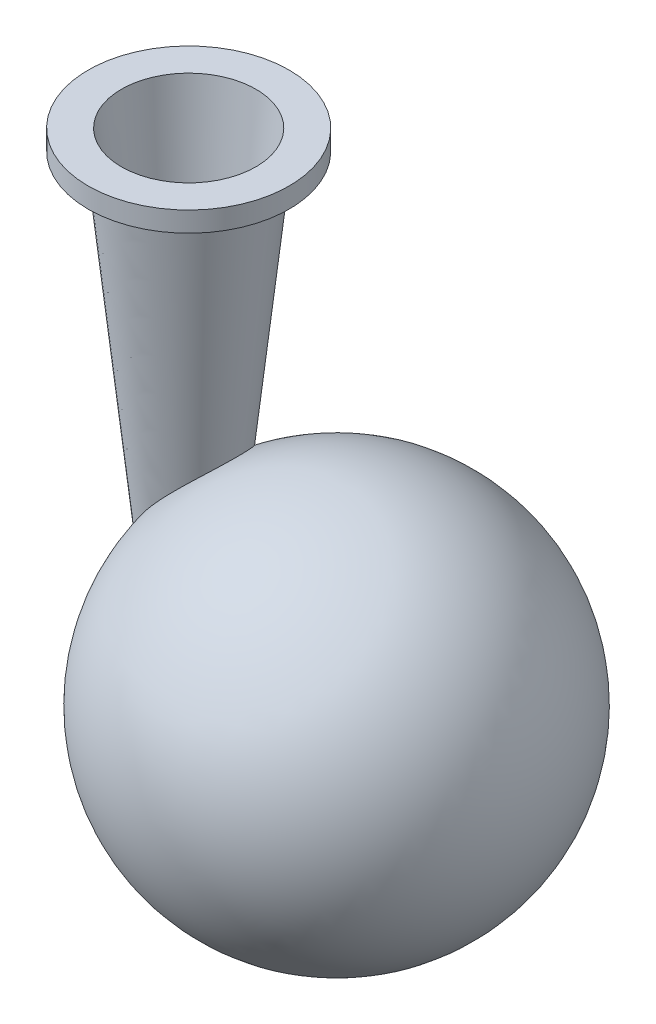
ISO-10303-21;
HEADER;
FILE_DESCRIPTION(('STEP AP214'),'2;1');
FILE_NAME('part.step','',(''),(''),'','','');
FILE_SCHEMA(('AUTOMOTIVE_DESIGN { 1 0 10303 214 1 1 1 1 }'));
ENDSEC;
DATA;
#1=APPLICATION_CONTEXT('core data for automotive mechanical design processes');
#2=APPLICATION_PROTOCOL_DEFINITION('international standard','automotive_design',2000,#1);
#3=PRODUCT_CONTEXT('',#1,'mechanical');
#4=PRODUCT('Part','Part','',(#3));
#5=PRODUCT_RELATED_PRODUCT_CATEGORY('part','',(#4));
#6=PRODUCT_DEFINITION_FORMATION('','',#4);
#7=PRODUCT_DEFINITION_CONTEXT('part definition',#1,'design');
#8=PRODUCT_DEFINITION('design','',#6,#7);
#9=PRODUCT_DEFINITION_SHAPE('','',#8);
#10=(LENGTH_UNIT() NAMED_UNIT(*) SI_UNIT(.MILLI.,.METRE.));
#11=(NAMED_UNIT(*) PLANE_ANGLE_UNIT() SI_UNIT($,.RADIAN.));
#12=(NAMED_UNIT(*) SI_UNIT($,.STERADIAN.) SOLID_ANGLE_UNIT());
#13=UNCERTAINTY_MEASURE_WITH_UNIT(LENGTH_MEASURE(1.E-05),#10,'distance_accuracy_value','');
#14=(GEOMETRIC_REPRESENTATION_CONTEXT(3) GLOBAL_UNCERTAINTY_ASSIGNED_CONTEXT((#13)) GLOBAL_UNIT_ASSIGNED_CONTEXT((#10,
#11,#12)) REPRESENTATION_CONTEXT('',''));
#15=CARTESIAN_POINT('',(0.,0.,0.));
#16=DIRECTION('',(0.,0.,1.));
#17=DIRECTION('',(1.,0.,0.));
#18=AXIS2_PLACEMENT_3D('',#15,#16,#17);
#19=CARTESIAN_POINT('',(-36.7934453221144,106.,0.));
#20=DIRECTION('',(0.,1.,0.));
#21=DIRECTION('',(0.,0.,1.));
#22=AXIS2_PLACEMENT_3D('',#19,#20,#21);
#23=PLANE('',#22);
#24=CARTESIAN_POINT('',(-36.7934453221144,106.,0.));
#25=DIRECTION('',(0.,1.,0.));
#26=DIRECTION('',(0.,0.,1.));
#27=AXIS2_PLACEMENT_3D('',#24,#25,#26);
#28=CIRCLE('',#27,16.7351960744522);
#29=CARTESIAN_POINT('',(-36.7934453221144,106.,16.7351960744522));
#30=VERTEX_POINT('',#29);
#31=EDGE_CURVE('E51',#30,#30,#28,.T.);
#32=ORIENTED_EDGE('',*,*,#31,.F.);
#33=EDGE_LOOP('',(#32));
#34=FACE_BOUND('',#33,.T.);
#35=CARTESIAN_POINT('',(-36.7934453221144,106.,0.));
#36=DIRECTION('',(0.,1.,0.));
#37=DIRECTION('',(0.,0.,1.));
#38=AXIS2_PLACEMENT_3D('',#35,#36,#37);
#39=CIRCLE('',#38,25.);
#40=CARTESIAN_POINT('',(-36.7934453221144,106.,25.));
#41=VERTEX_POINT('',#40);
#42=EDGE_CURVE('E78',#41,#41,#39,.T.);
#43=ORIENTED_EDGE('',*,*,#42,.T.);
#44=EDGE_LOOP('',(#43));
#45=FACE_BOUND('',#44,.T.);
#46=ADVANCED_FACE('F37',(#34,#45),#23,.T.);
#47=CARTESIAN_POINT('',(-36.7934453221144,106.209056926535,0.));
#48=DIRECTION('',(0.,1.,0.));
#49=DIRECTION('',(0.,0.,1.));
#50=AXIS2_PLACEMENT_3D('',#47,#48,#49);
#51=CONICAL_SURFACE('',#50,16.7571688428427,0.10471975511966);
#52=ORIENTED_EDGE('',*,*,#31,.T.);
#53=EDGE_LOOP('',(#52));
#54=FACE_BOUND('',#53,.T.);
#55=CARTESIAN_POINT('',(-27.4263025685843,36.9026804164011,1.41071099146784));
#56=CARTESIAN_POINT('',(-27.3970492944338,36.9310808457375,1.23651547855352));
#57=CARTESIAN_POINT('',(-27.373087259094,36.9543129977651,1.06059129479022));
#58=CARTESIAN_POINT('',(-27.3361602680941,36.9900971336509,0.706452942690002));
#59=CARTESIAN_POINT('',(-27.3231985256967,37.0026459968489,0.528238120663233));
#60=CARTESIAN_POINT('',(-27.3085183876449,37.0168575782865,0.170759458546034));
#61=CARTESIAN_POINT('',(-27.3068095690226,37.0185110237576,-0.00850514516609864));
#62=CARTESIAN_POINT('',(-27.314692056146,37.0108811310863,-0.366538051881213));
#63=CARTESIAN_POINT('',(-27.3242825316178,37.0015985965214,-0.545306390382389));
#64=CARTESIAN_POINT('',(-27.3545584177507,36.9722712288507,-0.900700380328845));
#65=CARTESIAN_POINT('',(-27.3752251542786,36.9522445099524,-1.07732912798217));
#66=CARTESIAN_POINT('',(-27.4272703357729,36.9017493298878,-1.4274826359512));
#67=CARTESIAN_POINT('',(-27.4586490039263,36.8712806511593,-1.60100733151356));
#68=CARTESIAN_POINT('',(-27.5315745729096,36.8003545177161,-1.94377510400843));
#69=CARTESIAN_POINT('',(-27.5731193472406,36.7598991519547,-2.11301906820616));
#70=CARTESIAN_POINT('',(-27.665736251553,36.6695291615726,-2.44635475959041));
#71=CARTESIAN_POINT('',(-27.7168122250198,36.6196107208085,-2.61044437697333));
#72=CARTESIAN_POINT('',(-27.8284627035048,36.5102305317104,-2.93471176187916));
#73=CARTESIAN_POINT('',(-27.8891521888707,36.4506530241141,-3.09481081275352));
#74=CARTESIAN_POINT('',(-28.0187158095815,36.3231118412911,-3.40822257298826));
#75=CARTESIAN_POINT('',(-28.0875925036742,36.2551455440607,-3.56153314008922));
#76=CARTESIAN_POINT('',(-28.3052819548724,36.0396658565888,-4.0105561964589));
#77=CARTESIAN_POINT('',(-28.4652006327547,35.880526272065,-4.29549229005575));
#78=CARTESIAN_POINT('',(-28.7647647630053,35.5801282677858,-4.76618991523883));
#79=CARTESIAN_POINT('',(-28.8993931746197,35.4444392306312,-4.95887060332119));
#80=CARTESIAN_POINT('',(-29.1791773853439,35.1606990861938,-5.326754558131));
#81=CARTESIAN_POINT('',(-29.324334538625,35.0126463883669,-5.5019555697731));
#82=CARTESIAN_POINT('',(-29.6233032441376,34.7056588272265,-5.83532445027385));
#83=CARTESIAN_POINT('',(-29.777130915144,34.5467035682513,-5.99345888776405));
#84=CARTESIAN_POINT('',(-30.0913479896883,34.2196657003495,-6.2927810268934));
#85=CARTESIAN_POINT('',(-30.2517374986016,34.0515829448321,-6.43396845624051));
#86=CARTESIAN_POINT('',(-30.642947234107,33.6384576553703,-6.75343611956644));
#87=CARTESIAN_POINT('',(-30.8761915324069,33.3896098082506,-6.92385106716142));
#88=CARTESIAN_POINT('',(-31.348953917872,32.8793354404824,-7.23447402427558));
#89=CARTESIAN_POINT('',(-31.5884743901592,32.6179041052183,-7.37467035752691));
#90=CARTESIAN_POINT('',(-32.0711614619733,32.0845259272862,-7.62687326864409));
#91=CARTESIAN_POINT('',(-32.3143315799495,31.812568477042,-7.73885050828753));
#92=CARTESIAN_POINT('',(-32.8017802349795,31.2602639967336,-7.93628221362414));
#93=CARTESIAN_POINT('',(-33.046058770397,30.9799169790502,-8.0217367184556));
#94=CARTESIAN_POINT('',(-33.636309523053,30.2931566759902,-8.1985504603386));
#95=CARTESIAN_POINT('',(-33.9819510036133,29.883197341353,-8.2773464914727));
#96=CARTESIAN_POINT('',(-34.667799628149,29.0526062132259,-8.38947077461552));
#97=CARTESIAN_POINT('',(-35.0080044395639,28.631970029166,-8.42278000242345));
#98=CARTESIAN_POINT('',(-35.6802202935485,27.7822360725922,-8.44767447745118));
#99=CARTESIAN_POINT('',(-36.0122208478404,27.3531286149488,-8.43920883892748));
#100=CARTESIAN_POINT('',(-36.6651322606596,26.4892001414717,-8.38357271643912));
#101=CARTESIAN_POINT('',(-36.9860445876919,26.0543798928394,-8.33640737842771));
#102=CARTESIAN_POINT('',(-37.6246159326965,25.1673843960017,-8.2038610375591));
#103=CARTESIAN_POINT('',(-37.9418692039327,24.715087558934,-8.11734602692629));
#104=CARTESIAN_POINT('',(-38.5609094165061,23.8082915836335,-7.90783852614558));
#105=CARTESIAN_POINT('',(-38.8626941037456,23.3537921349364,-7.78484073731338));
#106=CARTESIAN_POINT('',(-39.4488640925332,22.4453248720369,-7.50374110252013));
#107=CARTESIAN_POINT('',(-39.7332711292438,21.9913571204159,-7.34568430264377));
#108=CARTESIAN_POINT('',(-40.2836462702643,21.0858853834327,-6.99461236626813));
#109=CARTESIAN_POINT('',(-40.549620171381,20.6343806650301,-6.80160828951352));
#110=CARTESIAN_POINT('',(-40.9632147666176,19.9096301540493,-6.46062627413841));
#111=CARTESIAN_POINT('',(-41.1170229296352,19.6345898486456,-6.3238667862757));
#112=CARTESIAN_POINT('',(-41.416700361032,19.0877350001555,-6.03599074268522));
#113=CARTESIAN_POINT('',(-41.5625707932196,18.8159199887799,-5.88487630061038));
#114=CARTESIAN_POINT('',(-41.8459356943043,18.2768112330881,-5.56721241923666));
#115=CARTESIAN_POINT('',(-41.9834273387038,18.0095190351108,-5.40065782222832));
#116=CARTESIAN_POINT('',(-42.2493024592455,17.4815746847402,-5.05063384724255));
#117=CARTESIAN_POINT('',(-42.3776883295895,17.2209207985593,-4.86716894492278));
#118=CARTESIAN_POINT('',(-42.5859241842817,16.7890472730619,-4.54123552819737));
#119=CARTESIAN_POINT('',(-42.6684242165105,16.6152869323465,-4.40382500010208));
#120=CARTESIAN_POINT('',(-42.8282317013329,16.2737132657388,-4.11882088233563));
#121=CARTESIAN_POINT('',(-42.9055381257624,16.1059011204822,-3.97122528801047));
#122=CARTESIAN_POINT('',(-43.0541644808501,15.7785672518366,-3.6648865907606));
#123=CARTESIAN_POINT('',(-43.1254956529239,15.6190301860156,-3.50616550172228));
#124=CARTESIAN_POINT('',(-43.2613803999908,15.3108587441417,-3.17587137186811));
#125=CARTESIAN_POINT('',(-43.3259385513914,15.16221702703,-3.00430714499459));
#126=CARTESIAN_POINT('',(-43.4519755321034,14.868244917018,-2.63176892649008));
#127=CARTESIAN_POINT('',(-43.5127671233615,14.7241868256501,-2.42953687235017));
#128=CARTESIAN_POINT('',(-43.6223310919536,14.4614263686201,-2.00607378141279));
#129=CARTESIAN_POINT('',(-43.6711174120394,14.3426946108697,-1.784865190404));
#130=CARTESIAN_POINT('',(-43.7452879978098,14.160617400651,-1.36722157293466));
#131=CARTESIAN_POINT('',(-43.7733581013974,14.0910334288657,-1.1740729386512));
#132=CARTESIAN_POINT('',(-43.8061037629219,14.0095131934763,-0.877204614292546));
#133=CARTESIAN_POINT('',(-43.8154582281134,13.9861512122704,-0.777076223668369));
#134=CARTESIAN_POINT('',(-43.8308283457551,13.9477049282191,-0.575007708769117));
#135=CARTESIAN_POINT('',(-43.8368454906143,13.9326169253856,-0.473068415389552));
#136=CARTESIAN_POINT('',(-43.8454011223652,13.9111495929205,-0.267401393410464));
#137=CARTESIAN_POINT('',(-43.8479149042123,13.9048321125218,-0.163666134775052));
#138=CARTESIAN_POINT('',(-43.8493080553791,13.9013319703146,0.0439824389343055));
#139=CARTESIAN_POINT('',(-43.8481875083021,13.9041490983755,0.147895749857413));
#140=CARTESIAN_POINT('',(-43.8423455493243,13.9188179398045,0.355013051932662));
#141=CARTESIAN_POINT('',(-43.8376228280629,13.9306729383631,0.458216771387196));
#142=CARTESIAN_POINT('',(-43.824713549404,13.9630086166134,0.663081661492107));
#143=CARTESIAN_POINT('',(-43.8165251822596,13.9834938029297,0.764741997421596));
#144=CARTESIAN_POINT('',(-43.7954901388987,14.0359624604899,0.980269120499163));
#145=CARTESIAN_POINT('',(-43.7821426919312,14.0691763397748,1.09378732654618));
#146=CARTESIAN_POINT('',(-43.7515979476929,14.1448524214712,1.31719395558261));
#147=CARTESIAN_POINT('',(-43.7343979957752,14.1873210004725,1.42707981542479));
#148=CARTESIAN_POINT('',(-43.6776080988233,14.3268121966796,1.75089231070432));
#149=CARTESIAN_POINT('',(-43.632847577702,14.4358710322542,1.95878643654705));
#150=CARTESIAN_POINT('',(-43.5411127712975,14.6564051807247,2.32393025973811));
#151=CARTESIAN_POINT('',(-43.4957830837549,14.7643752462186,2.48381014548595));
#152=CARTESIAN_POINT('',(-43.398965787826,14.9922762633197,2.79296060125915));
#153=CARTESIAN_POINT('',(-43.347473756827,15.1122157948367,2.94222342761797));
#154=CARTESIAN_POINT('',(-43.2392004450362,15.3613111493174,3.23126881767635));
#155=CARTESIAN_POINT('',(-43.1824087084278,15.490485068238,3.37103165862369));
#156=CARTESIAN_POINT('',(-43.0642767243007,15.7557792531176,3.6418292314074));
#157=CARTESIAN_POINT('',(-43.0029347127917,15.8919022065426,3.7728605405563));
#158=CARTESIAN_POINT('',(-42.8743394089302,16.1736083435495,4.03078330665913));
#159=CARTESIAN_POINT('',(-42.80696492791,16.3193522599387,4.15743762729734));
#160=CARTESIAN_POINT('',(-42.668339765008,16.615253463747,4.40317178343955));
#161=CARTESIAN_POINT('',(-42.5970895420295,16.7654102277036,4.52225251208088));
#162=CARTESIAN_POINT('',(-42.4509334734886,17.0693629357066,4.75362513707086));
#163=CARTESIAN_POINT('',(-42.3760244458408,17.2231619853673,4.865910926752));
#164=CARTESIAN_POINT('',(-42.2228287907388,17.5335775784188,5.08411851833051));
#165=CARTESIAN_POINT('',(-42.1445417701497,17.6901944485077,5.19003957604193));
#166=CARTESIAN_POINT('',(-41.9045819612513,18.1640203297032,5.4993108914978));
#167=CARTESIAN_POINT('',(-41.7380814717102,18.4846394085166,5.69374579809028));
#168=CARTESIAN_POINT('',(-41.3933961374033,19.131566227283,6.0611895092491));
#169=CARTESIAN_POINT('',(-41.215214448801,19.4578724132763,6.2342040652213));
#170=CARTESIAN_POINT('',(-40.8842774685546,20.049170798732,6.52798844966377));
#171=CARTESIAN_POINT('',(-40.7334797590093,20.3135007683554,6.65231749960979));
#172=CARTESIAN_POINT('',(-40.4251378927345,20.843789455088,6.88859245249192));
#173=CARTESIAN_POINT('',(-40.2675930997366,21.1097483237713,7.00053718397007));
#174=CARTESIAN_POINT('',(-39.9459936371032,21.6427477803358,7.21229433171843));
#175=CARTESIAN_POINT('',(-39.7819359667808,21.9097888147134,7.31210106752736));
#176=CARTESIAN_POINT('',(-39.447666477862,22.4442948710984,7.49956179882042));
#177=CARTESIAN_POINT('',(-39.2774540793616,22.7117599307756,7.58721464537252));
#178=CARTESIAN_POINT('',(-38.7581958187597,23.5137850177232,7.83173579018595));
#179=CARTESIAN_POINT('',(-38.4003071641456,24.0483424903685,7.9703123107421));
#180=CARTESIAN_POINT('',(-37.6637458158956,25.1135974280219,8.19642848004723));
#181=CARTESIAN_POINT('',(-37.2850818164924,25.6442964040389,8.28398930266927));
#182=CARTESIAN_POINT('',(-36.5905611509912,26.5890378665643,8.39194645191815));
#183=CARTESIAN_POINT('',(-36.2780326363006,27.0043742355133,8.42252786189777));
#184=CARTESIAN_POINT('',(-35.6435652234873,27.8290370901432,8.4469938770518));
#185=CARTESIAN_POINT('',(-35.321625780986,28.2383632260941,8.44087635516567));
#186=CARTESIAN_POINT('',(-34.671215422825,29.048260552734,8.38900530758715));
#187=CARTESIAN_POINT('',(-34.3427555195327,29.4488444444717,8.34331383832056));
#188=CARTESIAN_POINT('',(-33.6818571075448,30.2393242058322,8.20886427511321));
#189=CARTESIAN_POINT('',(-33.349420281274,30.629224380407,8.12012380539977));
#190=CARTESIAN_POINT('',(-32.7906159988201,31.2728918590941,7.93138672066601));
#191=CARTESIAN_POINT('',(-32.5642516234896,31.530398181939,7.84401760323034));
#192=CARTESIAN_POINT('',(-32.1130306613126,32.0377429114597,7.64599834865882));
#193=CARTESIAN_POINT('',(-31.8881740249284,32.287581571036,7.53534898031706));
#194=CARTESIAN_POINT('',(-31.4421109994089,32.7777885063898,7.28938088278901));
#195=CARTESIAN_POINT('',(-31.2209013771018,33.0181654653076,7.1540854453724));
#196=CARTESIAN_POINT('',(-30.7843169767534,33.4877420669234,6.85723712723546));
#197=CARTESIAN_POINT('',(-30.5689405362046,33.7169449095638,6.69569182182076));
#198=CARTESIAN_POINT('',(-30.2008887872925,34.10493999216,6.38971759804368));
#199=CARTESIAN_POINT('',(-30.0462606401722,34.2667523508325,6.25147148245141));
#200=CARTESIAN_POINT('',(-29.7433380651504,34.5816676153276,5.95913680770905));
#201=CARTESIAN_POINT('',(-29.5950434434028,34.7347707877543,5.8050487339161));
#202=CARTESIAN_POINT('',(-29.1622848240957,35.178830851812,5.31847498174712));
#203=CARTESIAN_POINT('',(-28.8894238670215,35.45508634563,4.96125767578539));
#204=CARTESIAN_POINT('',(-28.4457735012873,35.9000350892495,4.26558567080868));
#205=CARTESIAN_POINT('',(-28.2656698071119,36.0790708913169,3.939766554262));
#206=CARTESIAN_POINT('',(-28.0250685644233,36.3168766670935,3.42378313131686));
#207=CARTESIAN_POINT('',(-27.949841900835,36.3909739393663,3.2473970360141));
#208=CARTESIAN_POINT('',(-27.810340757511,36.5280285818015,2.88620722940611));
#209=CARTESIAN_POINT('',(-27.7460612166962,36.5909911003089,2.70140745827139));
#210=CARTESIAN_POINT('',(-27.6328990974602,36.7016060741018,2.33506818054304));
#211=CARTESIAN_POINT('',(-27.5833516516111,36.749922692308,2.15393468956187));
#212=CARTESIAN_POINT('',(-27.4958965531413,36.835078628584,1.78611583355334));
#213=CARTESIAN_POINT('',(-27.457994465909,36.8719124590819,1.59942786060528));
#214=CARTESIAN_POINT('',(-27.4263025685843,36.9026804164011,1.41071099146784));
#215=B_SPLINE_CURVE_WITH_KNOTS('',3,(#55,#56,#57,#58,#59,#60,#61,#62,#63,#64,#65,#66,#67,#68,
#69,#70,#71,#72,#73,#74,#75,#76,#77,#78,#79,#80,#81,#82,#83,#84,#85,#86,#87,#88,#89,#90,#91,#92,
#93,#94,#95,#96,#97,#98,#99,#100,#101,#102,#103,#104,#105,#106,#107,#108,#109,#110,#111,#112,
#113,#114,#115,#116,#117,#118,#119,#120,#121,#122,#123,#124,#125,#126,#127,#128,#129,#130,#131,
#132,#133,#134,#135,#136,#137,#138,#139,#140,#141,#142,#143,#144,#145,#146,#147,#148,#149,#150,
#151,#152,#153,#154,#155,#156,#157,#158,#159,#160,#161,#162,#163,#164,#165,#166,#167,#168,#169,
#170,#171,#172,#173,#174,#175,#176,#177,#178,#179,#180,#181,#182,#183,#184,#185,#186,#187,#188,
#189,#190,#191,#192,#193,#194,#195,#196,#197,#198,#199,#200,#201,#202,#203,#204,#205,#206,#207,
#208,#209,#210,#211,#212,#213,#214),.UNSPECIFIED.,.T.,.F.,(4,2,2,2,2,2,2,2,2,2,2,2,2,2,2,2,2,2,
2,2,2,2,2,2,2,2,2,2,2,2,2,2,2,2,2,2,2,2,2,2,2,2,2,2,2,2,2,2,2,2,2,2,2,2,2,2,2,2,2,2,2,2,2,2,2,2,
2,2,2,2,2,2,2,2,2,2,2,2,2,4),(0.,0.536536701504476,1.07323007524868,1.61038015395342,
2.14749076524432,2.68369866510702,3.21991773773934,3.75602474228475,4.29234840263468,
4.83565288858928,5.37912762211821,6.46563908774251,7.2788831543093,8.09223200369191,
8.90714624367097,9.72207357533924,10.8641762410304,12.0067194194895,13.150445597256,
14.2941700872742,15.9177206543946,17.5419500404225,19.168158379688,20.7941505147897,
22.4703018742419,24.1466967937999,25.8209501227036,27.4946745247418,28.5248967381527,
29.5549674939632,30.5853835884361,31.6155277410989,32.3244120320194,33.0334362477464,
33.7410951078073,34.4482726936414,35.2134721899121,35.9777787550286,36.5967673468044,
36.9061505993862,37.2153953877703,37.5268100624374,37.8382175734369,38.1497383324749,
38.4614219675418,38.8179566493273,39.1747377685463,39.8888769254153,40.4826536414942,
41.0768590861494,41.6722626788541,42.2678983082957,42.8811543515167,43.494337940167,
44.1080646591723,44.7218629981055,45.9517238862821,47.1812538349427,48.167157873554,
49.1531550912444,50.1396119845113,51.1261620660837,53.0979065731183,55.0688321309808,
56.6296063755467,58.1904710830559,59.7488926005232,61.3066766391853,62.3673791303209,
63.4280465989025,64.4877168353822,65.547081808773,66.3356119874833,67.1241180148382,
68.6985555210349,69.9326594018745,70.5487337862179,71.1645225689615,71.7455090315393,
72.3267727207772),.UNSPECIFIED.);
#216=CARTESIAN_POINT('',(-27.4263025685843,36.9026804164011,1.41071099146784));
#217=VERTEX_POINT('',#216);
#218=EDGE_CURVE('E46',#217,#217,#215,.T.);
#219=ORIENTED_EDGE('',*,*,#218,.F.);
#220=EDGE_LOOP('',(#219));
#221=FACE_BOUND('',#220,.T.);
#222=ADVANCED_FACE('F67',(#54,#221),#51,.F.);
#223=CARTESIAN_POINT('',(0.,0.,0.));
#224=DIRECTION('',(0.,1.,0.));
#225=DIRECTION('',(1.,0.,0.));
#226=AXIS2_PLACEMENT_3D('',#223,#224,#225);
#227=SPHERICAL_SURFACE('',#226,46.);
#228=ORIENTED_EDGE('',*,*,#218,.T.);
#229=EDGE_LOOP('',(#228));
#230=FACE_BOUND('',#229,.T.);
#231=ADVANCED_FACE('F63',(#230),#227,.F.);
#232=CARTESIAN_POINT('',(-36.7934453221144,101.,0.));
#233=DIRECTION('',(0.,1.,0.));
#234=DIRECTION('',(0.,0.,1.));
#235=AXIS2_PLACEMENT_3D('',#232,#233,#234);
#236=CYLINDRICAL_SURFACE('',#235,25.);
#237=CARTESIAN_POINT('',(-36.7934453221144,101.,0.));
#238=DIRECTION('',(0.,1.,0.));
#239=DIRECTION('',(0.,0.,1.));
#240=AXIS2_PLACEMENT_3D('',#237,#238,#239);
#241=CIRCLE('',#240,25.);
#242=CARTESIAN_POINT('',(-36.7934453221144,101.,25.));
#243=VERTEX_POINT('',#242);
#244=EDGE_CURVE('E81',#243,#243,#241,.T.);
#245=ORIENTED_EDGE('',*,*,#244,.T.);
#246=EDGE_LOOP('',(#245));
#247=FACE_BOUND('',#246,.T.);
#248=ORIENTED_EDGE('',*,*,#42,.F.);
#249=EDGE_LOOP('',(#248));
#250=FACE_BOUND('',#249,.T.);
#251=ADVANCED_FACE('F91',(#247,#250),#236,.T.);
#252=CARTESIAN_POINT('',(-36.7934453221144,101.,0.));
#253=DIRECTION('',(0.,1.,0.));
#254=DIRECTION('',(0.,0.,1.));
#255=AXIS2_PLACEMENT_3D('',#252,#253,#254);
#256=PLANE('',#255);
#257=CARTESIAN_POINT('',(-36.7934453221144,101.,0.));
#258=DIRECTION('',(0.,1.,0.));
#259=DIRECTION('',(0.,0.,1.));
#260=AXIS2_PLACEMENT_3D('',#257,#258,#259);
#261=CIRCLE('',#260,18.2206914572508);
#262=CARTESIAN_POINT('',(-36.7934453221144,101.,18.2206914572508));
#263=VERTEX_POINT('',#262);
#264=EDGE_CURVE('E41',#263,#263,#261,.F.);
#265=ORIENTED_EDGE('',*,*,#264,.F.);
#266=EDGE_LOOP('',(#265));
#267=FACE_BOUND('',#266,.T.);
#268=ORIENTED_EDGE('',*,*,#244,.F.);
#269=EDGE_LOOP('',(#268));
#270=FACE_BOUND('',#269,.T.);
#271=ADVANCED_FACE('F94',(#267,#270),#256,.F.);
#272=CARTESIAN_POINT('',(0.,0.,0.));
#273=DIRECTION('',(0.,1.,0.));
#274=DIRECTION('',(1.,0.,0.));
#275=AXIS2_PLACEMENT_3D('',#272,#273,#274);
#276=SPHERICAL_SURFACE('',#275,48.);
#277=CARTESIAN_POINT('',(-45.764232913564,14.3869712627353,-1.62789548752308));
#278=CARTESIAN_POINT('',(-45.7832701701251,14.3413256184947,-1.49612016713819));
#279=CARTESIAN_POINT('',(-45.8002147423059,14.3004920760838,-1.36237779986475));
#280=CARTESIAN_POINT('',(-45.8295225031715,14.2296518143084,-1.09162748881074));
#281=CARTESIAN_POINT('',(-45.8418888146991,14.1996377153443,-0.954621839065765));
#282=CARTESIAN_POINT('',(-45.8617028766667,14.1514584765624,-0.678355702765492));
#283=CARTESIAN_POINT('',(-45.869156943579,14.1332781205467,-0.539098348728283));
#284=CARTESIAN_POINT('',(-45.8789434490817,14.1093951060892,-0.259327212029614));
#285=CARTESIAN_POINT('',(-45.8812759122974,14.1036923876533,-0.118813435412441));
#286=CARTESIAN_POINT('',(-45.8807423498173,14.1049959897315,0.162455008348577));
#287=CARTESIAN_POINT('',(-45.877864842829,14.1120303792111,0.303209522944569));
#288=CARTESIAN_POINT('',(-45.866983000396,14.1385793871343,0.583324219557414));
#289=CARTESIAN_POINT('',(-45.8589785943908,14.1580941773435,0.722684382357228));
#290=CARTESIAN_POINT('',(-45.8380729445503,14.2089007150244,0.999041460269779));
#291=CARTESIAN_POINT('',(-45.8251651070871,14.2402083197742,1.13603493242749));
#292=CARTESIAN_POINT('',(-45.7947954305326,14.3135578225355,1.4066546296254));
#293=CARTESIAN_POINT('',(-45.7773308323027,14.3556062238212,1.54027876057092));
#294=CARTESIAN_POINT('',(-45.7327351017894,14.4624247209297,1.8406236255146));
#295=CARTESIAN_POINT('',(-45.7042668430739,14.5302585784774,2.00605558688972));
#296=CARTESIAN_POINT('',(-45.6413342336194,14.6790191169958,2.32975581143229));
#297=CARTESIAN_POINT('',(-45.6068665161878,14.7599531475422,2.48801998910403));
#298=CARTESIAN_POINT('',(-45.5326372016196,14.932705378152,2.79751610750241));
#299=CARTESIAN_POINT('',(-45.492866631984,15.0245419960132,2.94873552995646));
#300=CARTESIAN_POINT('',(-45.4087214996178,15.2169948548367,3.24406061203642));
#301=CARTESIAN_POINT('',(-45.3643473263337,15.3176103530264,3.38816687188795));
#302=CARTESIAN_POINT('',(-45.2329963378672,15.6124408524488,3.78649532620748));
#303=CARTESIAN_POINT('',(-45.1412097738276,15.815074162547,4.03291762041383));
#304=CARTESIAN_POINT('',(-44.9462231404589,16.2370377706083,4.50620129219954));
#305=CARTESIAN_POINT('',(-44.8430134063275,16.4563821576606,4.7330458123543));
#306=CARTESIAN_POINT('',(-44.6264712028046,16.9073997720794,5.16995269923359));
#307=CARTESIAN_POINT('',(-44.5131177300901,17.1390981589927,5.37997845545637));
#308=CARTESIAN_POINT('',(-44.277451114233,17.6112119232041,5.78473531909059));
#309=CARTESIAN_POINT('',(-44.1551348219854,17.8516303491773,5.97946100050908));
#310=CARTESIAN_POINT('',(-43.9067913349757,18.3301686961967,6.34834171155376));
#311=CARTESIAN_POINT('',(-43.7810517726834,18.5680651439283,6.52298254139581));
#312=CARTESIAN_POINT('',(-43.522418072877,19.0483019208919,6.86033101592943));
#313=CARTESIAN_POINT('',(-43.3895249328193,19.2906416274884,7.02304031685372));
#314=CARTESIAN_POINT('',(-43.1168241029121,19.7788992052209,7.33741077919048));
#315=CARTESIAN_POINT('',(-42.9770109509646,20.0248197911733,7.48906297178493));
#316=CARTESIAN_POINT('',(-42.6908759468623,20.5191992252939,7.78168280107577));
#317=CARTESIAN_POINT('',(-42.5445538917952,20.7676581524075,7.92265010430429));
#318=CARTESIAN_POINT('',(-42.095990450993,21.5161843284994,8.33028778422993));
#319=CARTESIAN_POINT('',(-41.7843127195743,22.0191122536477,8.58151007735774));
#320=CARTESIAN_POINT('',(-41.1378781499423,23.0281479930809,9.04388653118109));
#321=CARTESIAN_POINT('',(-40.8031280140845,23.5342548454086,9.25505226167615));
#322=CARTESIAN_POINT('',(-40.0912180202655,24.5775922887269,9.64882142334064));
#323=CARTESIAN_POINT('',(-39.7127177300978,25.1148547485994,9.82892636175555));
#324=CARTESIAN_POINT('',(-38.9336274288552,26.1871172621673,10.142554832006));
#325=CARTESIAN_POINT('',(-38.5330336910725,26.7221169176866,10.2760704771898));
#326=CARTESIAN_POINT('',(-37.7126893022091,27.786594718311,10.4938616768371));
#327=CARTESIAN_POINT('',(-37.2929585888828,28.3160779345119,10.5781872705188));
#328=CARTESIAN_POINT('',(-36.4369675499528,29.3673150374179,10.6944281522804));
#329=CARTESIAN_POINT('',(-36.0007115189132,29.8890708839294,10.7263569628136));
#330=CARTESIAN_POINT('',(-35.2048488254242,30.8174803233941,10.7329457582206));
#331=CARTESIAN_POINT('',(-34.8475784613218,31.2260770884166,10.7178794473759));
#332=CARTESIAN_POINT('',(-34.127070320869,32.03481863771,10.6493126309937));
#333=CARTESIAN_POINT('',(-33.7638324988217,32.4349633572041,10.5958118310025));
#334=CARTESIAN_POINT('',(-33.0345295349144,33.224376038941,10.447714010051));
#335=CARTESIAN_POINT('',(-32.6684670737195,33.6136530017059,10.3531521388425));
#336=CARTESIAN_POINT('',(-31.9367201532821,34.3791451672598,10.1199810026289));
#337=CARTESIAN_POINT('',(-31.5710356125586,34.7553643379065,9.98138525046566));
#338=CARTESIAN_POINT('',(-30.9394049644959,35.3953931896977,9.69946983441746));
#339=CARTESIAN_POINT('',(-30.6723785862965,35.6628758496164,9.56685874201878));
#340=CARTESIAN_POINT('',(-30.1429829152892,36.1875927616923,9.27463710563456));
#341=CARTESIAN_POINT('',(-29.8806134420365,36.4448274114197,9.1150276103113));
#342=CARTESIAN_POINT('',(-29.363303486452,36.9470239191496,8.76777041881342));
#343=CARTESIAN_POINT('',(-29.1083561010098,37.1919973442106,8.58014983994282));
#344=CARTESIAN_POINT('',(-28.6086203940836,37.6678166422232,8.17571105184615));
#345=CARTESIAN_POINT('',(-28.3638295283406,37.898666060271,7.9589002134041));
#346=CARTESIAN_POINT('',(-27.9422579029034,38.292932981203,7.54829374222516));
#347=CARTESIAN_POINT('',(-27.7627124311363,38.4597102691713,7.36054980101339));
#348=CARTESIAN_POINT('',(-27.4135789764055,38.7820894839357,6.96708913328516));
#349=CARTESIAN_POINT('',(-27.2439888573445,38.9376938096997,6.7613762860584));
#350=CARTESIAN_POINT('',(-26.9168911170865,39.2361962693238,6.3322095751621));
#351=CARTESIAN_POINT('',(-26.7593739335057,39.379104473743,6.10877004349389));
#352=CARTESIAN_POINT('',(-26.4584812584689,39.6507771528813,5.64442947267768));
#353=CARTESIAN_POINT('',(-26.3151034342687,39.7795439610802,5.40353132530824));
#354=CARTESIAN_POINT('',(-26.0679041426319,40.000623427873,4.94770863860522));
#355=CARTESIAN_POINT('',(-25.9615089328549,40.0954061683647,4.73537408915294));
#356=CARTESIAN_POINT('',(-25.7614026674741,40.2731286174306,4.30005794213599));
#357=CARTESIAN_POINT('',(-25.6676890831623,40.3560706872088,4.07707847919145));
#358=CARTESIAN_POINT('',(-25.4942844261594,40.509150657694,3.62152163291276));
#359=CARTESIAN_POINT('',(-25.4145900757336,40.5792915514946,3.38894650881076));
#360=CARTESIAN_POINT('',(-25.2704502621966,40.7058919592627,2.91546683197298));
#361=CARTESIAN_POINT('',(-25.2060050144433,40.7623512800102,2.6745621616569));
#362=CARTESIAN_POINT('',(-25.0931617242182,40.8610608952973,2.18469829747596));
#363=CARTESIAN_POINT('',(-25.0448540991855,40.9032311479048,1.93570202393917));
#364=CARTESIAN_POINT('',(-24.9656762807606,40.9722824735166,1.43284667751891));
#365=CARTESIAN_POINT('',(-24.9348062127043,40.999163436626,1.17898756969639));
#366=CARTESIAN_POINT('',(-24.8911131824014,41.0371950106457,0.668618759469545));
#367=CARTESIAN_POINT('',(-24.8782850951654,41.0483500886395,0.412109830635061));
#368=CARTESIAN_POINT('',(-24.8709193542613,41.0547563704533,-0.101358418593524));
#369=CARTESIAN_POINT('',(-24.8763802927453,41.0500087984234,-0.358317702798404));
#370=CARTESIAN_POINT('',(-24.9041139127234,41.0258795730078,-0.846471520306356));
#371=CARTESIAN_POINT('',(-24.924768657508,41.0079062291292,-1.07783078049354));
#372=CARTESIAN_POINT('',(-24.9806714676415,40.9592066671394,-1.53740331408651));
#373=CARTESIAN_POINT('',(-25.0159184288743,40.9284814138973,-1.76561682416496));
#374=CARTESIAN_POINT('',(-25.1004489643414,40.8546803164533,-2.2173690778099));
#375=CARTESIAN_POINT('',(-25.1497315474188,40.8116053443529,-2.44090815027618));
#376=CARTESIAN_POINT('',(-25.2616005237083,40.7136327874856,-2.88198076133866));
#377=CARTESIAN_POINT('',(-25.324187492837,40.6587346909212,-3.09951403949699));
#378=CARTESIAN_POINT('',(-25.4631239391454,40.5365737595858,-3.53154193938644));
#379=CARTESIAN_POINT('',(-25.5397162030886,40.469092297881,-3.74589639840756));
#380=CARTESIAN_POINT('',(-25.7048263929578,40.3232056444996,-4.16621124316748));
#381=CARTESIAN_POINT('',(-25.7933489965709,40.244796167717,-4.37216829495747));
#382=CARTESIAN_POINT('',(-25.9812339216261,40.0778343813494,-4.77483041691276));
#383=CARTESIAN_POINT('',(-26.0805973612691,39.9892810254053,-4.97153452966371));
#384=CARTESIAN_POINT('',(-26.2890793364616,39.8028082037417,-5.35510379251522));
#385=CARTESIAN_POINT('',(-26.3981997411475,39.7048869431656,-5.54196704646658));
#386=CARTESIAN_POINT('',(-26.6703716568974,39.4596790975428,-5.97789129627818));
#387=CARTESIAN_POINT('',(-26.8375842151376,39.3082722250536,-6.2220587130551));
#388=CARTESIAN_POINT('',(-27.186231511625,38.9906019489873,-6.68970481675564));
#389=CARTESIAN_POINT('',(-27.36767055024,38.8243340510912,-6.9131772031352));
#390=CARTESIAN_POINT('',(-27.7424726515571,38.4785213830492,-7.33956492555545));
#391=CARTESIAN_POINT('',(-27.9358526126565,38.2989577221999,-7.54245000255619));
#392=CARTESIAN_POINT('',(-28.3319936076212,37.9284042783836,-7.92748096594415));
#393=CARTESIAN_POINT('',(-28.5347549902321,37.7374140705679,-8.10962608047008));
#394=CARTESIAN_POINT('',(-29.0167436252854,37.2798244657068,-8.51118214764459));
#395=CARTESIAN_POINT('',(-29.2988613208501,37.0093040618049,-8.72267773397964));
#396=CARTESIAN_POINT('',(-29.8721179288403,36.4533208141888,-9.11094110905651));
#397=CARTESIAN_POINT('',(-30.1632596282879,36.1678533349925,-9.28769804266983));
#398=CARTESIAN_POINT('',(-30.751417105251,35.5841114761475,-9.60827254241745));
#399=CARTESIAN_POINT('',(-31.0484388345464,35.2858237203087,-9.75205466204735));
#400=CARTESIAN_POINT('',(-31.6451899220151,34.6787561548767,-10.0081699378012));
#401=CARTESIAN_POINT('',(-31.9449193427803,34.3699761022825,-10.1205023649946));
#402=CARTESIAN_POINT('',(-32.6527655067507,33.6307606772321,-10.3505607993549));
#403=CARTESIAN_POINT('',(-33.0610602713292,33.1965439873768,-10.4556726852169));
#404=CARTESIAN_POINT('',(-33.8735763182176,32.3151262276771,-10.615053226089));
#405=CARTESIAN_POINT('',(-34.2777961087627,31.8679206198851,-10.6693038859259));
#406=CARTESIAN_POINT('',(-35.0785168814695,30.9631464632097,-10.7306694242335));
#407=CARTESIAN_POINT('',(-35.4750136287171,30.5055725107017,-10.7377591294378));
#408=CARTESIAN_POINT('',(-36.2569883913634,29.5826790312923,-10.7080309665099));
#409=CARTESIAN_POINT('',(-36.6424675015188,29.1173602812663,-10.6712174764148));
#410=CARTESIAN_POINT('',(-37.4092238435116,28.1695475859498,-10.5551202345262));
#411=CARTESIAN_POINT('',(-37.7901704101978,27.6869112725413,-10.4748245309663));
#412=CARTESIAN_POINT('',(-38.5358135290292,26.717556037863,-10.2736239024969));
#413=CARTESIAN_POINT('',(-38.9005088511623,26.2308368108703,-10.1527159096482));
#414=CARTESIAN_POINT('',(-39.6119980476558,25.2550164821158,-9.8720979806863));
#415=CARTESIAN_POINT('',(-39.9587800674594,24.7659140316379,-9.71236273869028));
#416=CARTESIAN_POINT('',(-40.6325116291377,23.7878271817595,-9.35535649971718));
#417=CARTESIAN_POINT('',(-40.9594636443197,23.2988427752447,-9.15809019656979));
#418=CARTESIAN_POINT('',(-41.5661471119525,22.3634049539764,-8.74401187613704));
#419=CARTESIAN_POINT('',(-41.847553673657,21.9167433293636,-8.5301171510103));
#420=CARTESIAN_POINT('',(-42.3912606448095,21.0279823798843,-8.07026525242609));
#421=CARTESIAN_POINT('',(-42.6535560420039,20.5858842777938,-7.82429971465552));
#422=CARTESIAN_POINT('',(-43.0312417115271,19.9294744954261,-7.43028502104547));
#423=CARTESIAN_POINT('',(-43.1544155267117,19.7119708567836,-7.29489110360679));
#424=CARTESIAN_POINT('',(-43.3953951545028,19.2796797259475,-7.01529603321179));
#425=CARTESIAN_POINT('',(-43.5132015194124,19.0648919559457,-6.8710957900038));
#426=CARTESIAN_POINT('',(-43.7431171297611,18.6389288760002,-6.57348492106357));
#427=CARTESIAN_POINT('',(-43.8552302710495,18.4277511631847,-6.42008075472801));
#428=CARTESIAN_POINT('',(-44.0735406086812,18.0098187711529,-6.10328735712991));
#429=CARTESIAN_POINT('',(-44.1797373687181,17.8030644188302,-5.93989739131828));
#430=CARTESIAN_POINT('',(-44.3809205539706,17.4049441486623,-5.61026197313505));
#431=CARTESIAN_POINT('',(-44.4761996303854,17.2133129105238,-5.44451706229067));
#432=CARTESIAN_POINT('',(-44.6605124621815,16.8368220793254,-5.1022769789128));
#433=CARTESIAN_POINT('',(-44.7495479494817,16.6519606152397,-4.9257848131602));
#434=CARTESIAN_POINT('',(-44.9207537113756,16.2910292069363,-4.56085956862941));
#435=CARTESIAN_POINT('',(-45.0029246250119,16.1149584449826,-4.37242760423928));
#436=CARTESIAN_POINT('',(-45.159505600513,15.7744650000332,-3.98226259518469));
#437=CARTESIAN_POINT('',(-45.2339184875284,15.6100380838795,-3.78053443642869));
#438=CARTESIAN_POINT('',(-45.3528639304043,15.3435686100701,-3.42471232569207));
#439=CARTESIAN_POINT('',(-45.3996871816625,15.237550769695,-3.27436512288987));
#440=CARTESIAN_POINT('',(-45.4883191275312,15.0350343811758,-2.9658990884878));
#441=CARTESIAN_POINT('',(-45.5301275112211,14.9385364233279,-2.80777977587488));
#442=CARTESIAN_POINT('',(-45.6079104280049,14.7575331861244,-2.48386368307491));
#443=CARTESIAN_POINT('',(-45.6438975313996,14.6730021164987,-2.31808446702567));
#444=CARTESIAN_POINT('',(-45.70925878922,14.5184112303264,-1.97868375222794));
#445=CARTESIAN_POINT('',(-45.7386373059006,14.4483418703002,-1.80506751803404));
#446=CARTESIAN_POINT('',(-45.764232913564,14.3869712627353,-1.62789548752308));
#447=B_SPLINE_CURVE_WITH_KNOTS('',3,(#277,#278,#279,#280,#281,#282,#283,#284,#285,#286,#287,
#288,#289,#290,#291,#292,#293,#294,#295,#296,#297,#298,#299,#300,#301,#302,#303,#304,#305,#306,
#307,#308,#309,#310,#311,#312,#313,#314,#315,#316,#317,#318,#319,#320,#321,#322,#323,#324,#325,
#326,#327,#328,#329,#330,#331,#332,#333,#334,#335,#336,#337,#338,#339,#340,#341,#342,#343,#344,
#345,#346,#347,#348,#349,#350,#351,#352,#353,#354,#355,#356,#357,#358,#359,#360,#361,#362,#363,
#364,#365,#366,#367,#368,#369,#370,#371,#372,#373,#374,#375,#376,#377,#378,#379,#380,#381,#382,
#383,#384,#385,#386,#387,#388,#389,#390,#391,#392,#393,#394,#395,#396,#397,#398,#399,#400,#401,
#402,#403,#404,#405,#406,#407,#408,#409,#410,#411,#412,#413,#414,#415,#416,#417,#418,#419,#420,
#421,#422,#423,#424,#425,#426,#427,#428,#429,#430,#431,#432,#433,#434,#435,#436,#437,#438,#439,
#440,#441,#442,#443,#444,#445,#446),.UNSPECIFIED.,.T.,.F.,(4,2,2,2,2,2,2,2,2,2,2,2,2,2,2,2,2,2,
2,2,2,2,2,2,2,2,2,2,2,2,2,2,2,2,2,2,2,2,2,2,2,2,2,2,2,2,2,2,2,2,2,2,2,2,2,2,2,2,2,2,2,2,2,2,2,2,
2,2,2,2,2,2,2,2,2,2,2,2,2,2,2,2,2,2,4),(0.,0.4221126046504,0.843936752460198,1.26521742843451,
1.68649607883814,2.10870423779792,2.53091820766172,2.95370194856929,3.37674228338037,
3.91903683428,4.46163668939697,5.00516656572185,5.54865049901811,6.54289466128117,
7.53798654876464,8.5351887492366,9.53274301444237,10.4947437574043,11.4566107098803,
12.4192493819988,13.3819180850325,15.3083871625996,17.2342989553802,19.2766413523078,
21.3193293101362,23.3599356770317,25.4000153255919,27.0276206700335,28.6552384839884,
30.281465736961,31.9071944247299,33.1078839428936,34.3085268350108,35.5080148422986,
36.707200534936,37.6325223628733,38.5576449153918,39.4820269842623,40.4062562904101,
41.1726494342715,41.9388895339419,42.7049502458201,43.4710217758686,44.2413162240229,
45.0116162087569,45.7816973385241,46.5517191905477,47.2498175000315,47.947862997747,
48.6458592136325,49.3438856503379,50.0554137408534,50.7672216257083,51.4791030010237,
52.1911210444293,53.1869199277967,54.1830209894695,55.1805655270596,56.1781471772788,
57.5094261016815,58.8411203647843,60.174239501265,61.5073895337806,63.3204299097331,
65.1341115143594,66.9487611364818,68.7632298164425,70.621864235028,72.4806390904169,
74.3406286767238,76.2003857957917,77.9080687465662,79.6161979683212,80.4688563991504,
81.3214268935686,82.1734058907706,83.0254476346156,83.8371912343665,84.6487087652112,
85.4601506652033,86.2712960320309,86.8404134068275,87.4095660485492,87.9774727812962,
88.5450035378274),.UNSPECIFIED.);
#448=CARTESIAN_POINT('',(-45.764232913564,14.3869712627353,-1.62789548752308));
#449=VERTEX_POINT('',#448);
#450=EDGE_CURVE('E10',#449,#449,#447,.T.);
#451=ORIENTED_EDGE('',*,*,#450,.F.);
#452=EDGE_LOOP('',(#451));
#453=FACE_BOUND('',#452,.T.);
#454=ADVANCED_FACE('F39',(#453),#276,.T.);
#455=CARTESIAN_POINT('',(-36.7934453221144,106.,0.));
#456=DIRECTION('',(0.,1.,0.));
#457=DIRECTION('',(0.,0.,1.));
#458=AXIS2_PLACEMENT_3D('',#455,#456,#457);
#459=CONICAL_SURFACE('',#458,18.7462126335792,0.10471975511966);
#460=ORIENTED_EDGE('',*,*,#450,.T.);
#461=EDGE_LOOP('',(#460));
#462=FACE_BOUND('',#461,.T.);
#463=ORIENTED_EDGE('',*,*,#264,.T.);
#464=EDGE_LOOP('',(#463));
#465=FACE_BOUND('',#464,.T.);
#466=ADVANCED_FACE('F58',(#462,#465),#459,.T.);
#467=CLOSED_SHELL('',(#46,#222,#231,#251,#271,#454,#466));
#468=MANIFOLD_SOLID_BREP('B2',#467);
#469=ADVANCED_BREP_SHAPE_REPRESENTATION('',(#18,#468),#14);
#470=SHAPE_DEFINITION_REPRESENTATION(#9,#469);
ENDSEC;
END-ISO-10303-21;
